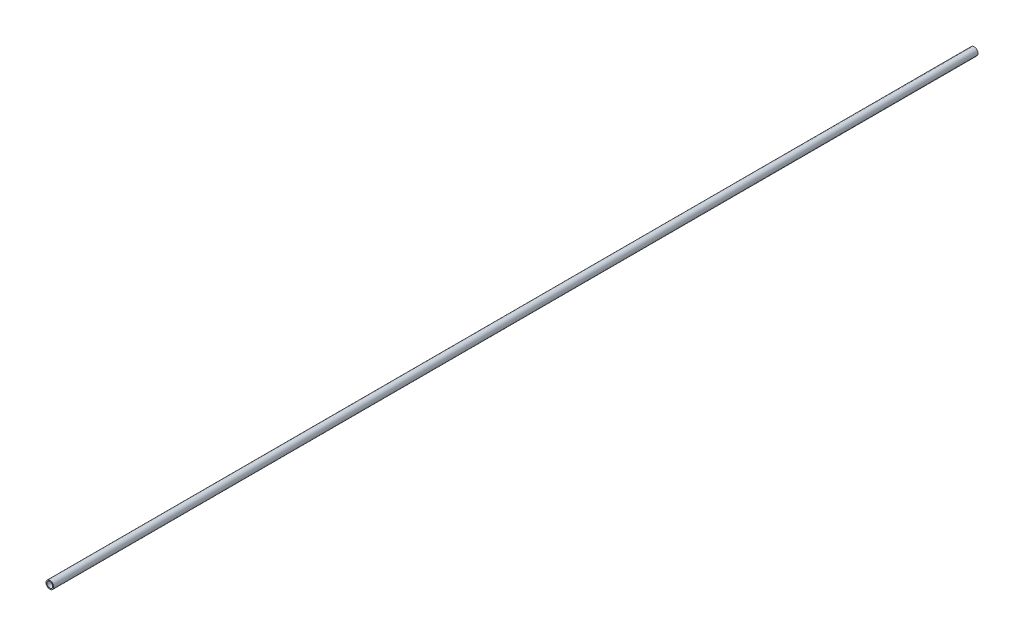
ISO-10303-21;
HEADER;
FILE_DESCRIPTION(('STEP AP214'),'2;1');
FILE_NAME('part.step','',(''),(''),'','','');
FILE_SCHEMA(('AUTOMOTIVE_DESIGN { 1 0 10303 214 1 1 1 1 }'));
ENDSEC;
DATA;
#1=APPLICATION_CONTEXT('core data for automotive mechanical design processes');
#2=APPLICATION_PROTOCOL_DEFINITION('international standard','automotive_design',2000,#1);
#3=PRODUCT_CONTEXT('',#1,'mechanical');
#4=PRODUCT('Part','Part','',(#3));
#5=PRODUCT_RELATED_PRODUCT_CATEGORY('part','',(#4));
#6=PRODUCT_DEFINITION_FORMATION('','',#4);
#7=PRODUCT_DEFINITION_CONTEXT('part definition',#1,'design');
#8=PRODUCT_DEFINITION('design','',#6,#7);
#9=PRODUCT_DEFINITION_SHAPE('','',#8);
#10=(LENGTH_UNIT() NAMED_UNIT(*) SI_UNIT(.MILLI.,.METRE.));
#11=(NAMED_UNIT(*) PLANE_ANGLE_UNIT() SI_UNIT($,.RADIAN.));
#12=(NAMED_UNIT(*) SI_UNIT($,.STERADIAN.) SOLID_ANGLE_UNIT());
#13=UNCERTAINTY_MEASURE_WITH_UNIT(LENGTH_MEASURE(1.E-05),#10,'distance_accuracy_value','');
#14=(GEOMETRIC_REPRESENTATION_CONTEXT(3) GLOBAL_UNCERTAINTY_ASSIGNED_CONTEXT((#13)) GLOBAL_UNIT_ASSIGNED_CONTEXT((#10,
#11,#12)) REPRESENTATION_CONTEXT('',''));
#15=CARTESIAN_POINT('',(0.,0.,0.));
#16=DIRECTION('',(0.,0.,1.));
#17=DIRECTION('',(1.,0.,0.));
#18=AXIS2_PLACEMENT_3D('',#15,#16,#17);
#19=CARTESIAN_POINT('',(0.,0.,762.));
#20=DIRECTION('',(0.,0.,1.));
#21=DIRECTION('',(1.,0.,0.));
#22=AXIS2_PLACEMENT_3D('',#19,#20,#21);
#23=PLANE('',#22);
#24=CARTESIAN_POINT('',(0.,0.,762.));
#25=DIRECTION('',(0.,0.,1.));
#26=DIRECTION('',(1.,0.,0.));
#27=AXIS2_PLACEMENT_3D('',#24,#25,#26);
#28=CIRCLE('',#27,6.35);
#29=CARTESIAN_POINT('',(6.35,0.,762.));
#30=VERTEX_POINT('',#29);
#31=EDGE_CURVE('E10',#30,#30,#28,.T.);
#32=ORIENTED_EDGE('',*,*,#31,.T.);
#33=EDGE_LOOP('',(#32));
#34=FACE_BOUND('',#33,.T.);
#35=CARTESIAN_POINT('',(0.,0.,762.));
#36=DIRECTION('',(0.,0.,1.));
#37=DIRECTION('',(1.,0.,0.));
#38=AXIS2_PLACEMENT_3D('',#35,#36,#37);
#39=CIRCLE('',#38,4.7625);
#40=CARTESIAN_POINT('',(4.7625,0.,762.));
#41=VERTEX_POINT('',#40);
#42=EDGE_CURVE('E46',#41,#41,#39,.T.);
#43=ORIENTED_EDGE('',*,*,#42,.F.);
#44=EDGE_LOOP('',(#43));
#45=FACE_BOUND('',#44,.T.);
#46=ADVANCED_FACE('F34',(#34,#45),#23,.T.);
#47=CARTESIAN_POINT('',(0.,0.,-762.));
#48=DIRECTION('',(0.,0.,1.));
#49=DIRECTION('',(1.,0.,0.));
#50=AXIS2_PLACEMENT_3D('',#47,#48,#49);
#51=PLANE('',#50);
#52=CARTESIAN_POINT('',(0.,0.,-762.));
#53=DIRECTION('',(0.,0.,1.));
#54=DIRECTION('',(1.,0.,0.));
#55=AXIS2_PLACEMENT_3D('',#52,#53,#54);
#56=CIRCLE('',#55,6.35);
#57=CARTESIAN_POINT('',(6.35,0.,-762.));
#58=VERTEX_POINT('',#57);
#59=EDGE_CURVE('E39',#58,#58,#56,.T.);
#60=ORIENTED_EDGE('',*,*,#59,.F.);
#61=EDGE_LOOP('',(#60));
#62=FACE_BOUND('',#61,.T.);
#63=CARTESIAN_POINT('',(0.,0.,-762.));
#64=DIRECTION('',(0.,0.,1.));
#65=DIRECTION('',(1.,0.,0.));
#66=AXIS2_PLACEMENT_3D('',#63,#64,#65);
#67=CIRCLE('',#66,4.7625);
#68=CARTESIAN_POINT('',(4.7625,0.,-762.));
#69=VERTEX_POINT('',#68);
#70=EDGE_CURVE('E48',#69,#69,#67,.T.);
#71=ORIENTED_EDGE('',*,*,#70,.T.);
#72=EDGE_LOOP('',(#71));
#73=FACE_BOUND('',#72,.T.);
#74=ADVANCED_FACE('F59',(#62,#73),#51,.F.);
#75=CARTESIAN_POINT('',(0.,0.,762.));
#76=DIRECTION('',(0.,0.,-1.));
#77=DIRECTION('',(-1.,0.,0.));
#78=AXIS2_PLACEMENT_3D('',#75,#76,#77);
#79=CYLINDRICAL_SURFACE('',#78,6.35);
#80=ORIENTED_EDGE('',*,*,#31,.F.);
#81=EDGE_LOOP('',(#80));
#82=FACE_BOUND('',#81,.T.);
#83=ORIENTED_EDGE('',*,*,#59,.T.);
#84=EDGE_LOOP('',(#83));
#85=FACE_BOUND('',#84,.T.);
#86=ADVANCED_FACE('F40',(#82,#85),#79,.T.);
#87=CARTESIAN_POINT('',(0.,0.,762.));
#88=DIRECTION('',(0.,0.,-1.));
#89=DIRECTION('',(-1.,0.,0.));
#90=AXIS2_PLACEMENT_3D('',#87,#88,#89);
#91=CYLINDRICAL_SURFACE('',#90,4.7625);
#92=ORIENTED_EDGE('',*,*,#42,.T.);
#93=EDGE_LOOP('',(#92));
#94=FACE_BOUND('',#93,.T.);
#95=ORIENTED_EDGE('',*,*,#70,.F.);
#96=EDGE_LOOP('',(#95));
#97=FACE_BOUND('',#96,.T.);
#98=ADVANCED_FACE('F53',(#94,#97),#91,.F.);
#99=CLOSED_SHELL('',(#46,#74,#86,#98));
#100=MANIFOLD_SOLID_BREP('B2',#99);
#101=ADVANCED_BREP_SHAPE_REPRESENTATION('',(#18,#100),#14);
#102=SHAPE_DEFINITION_REPRESENTATION(#9,#101);
ENDSEC;
END-ISO-10303-21;
